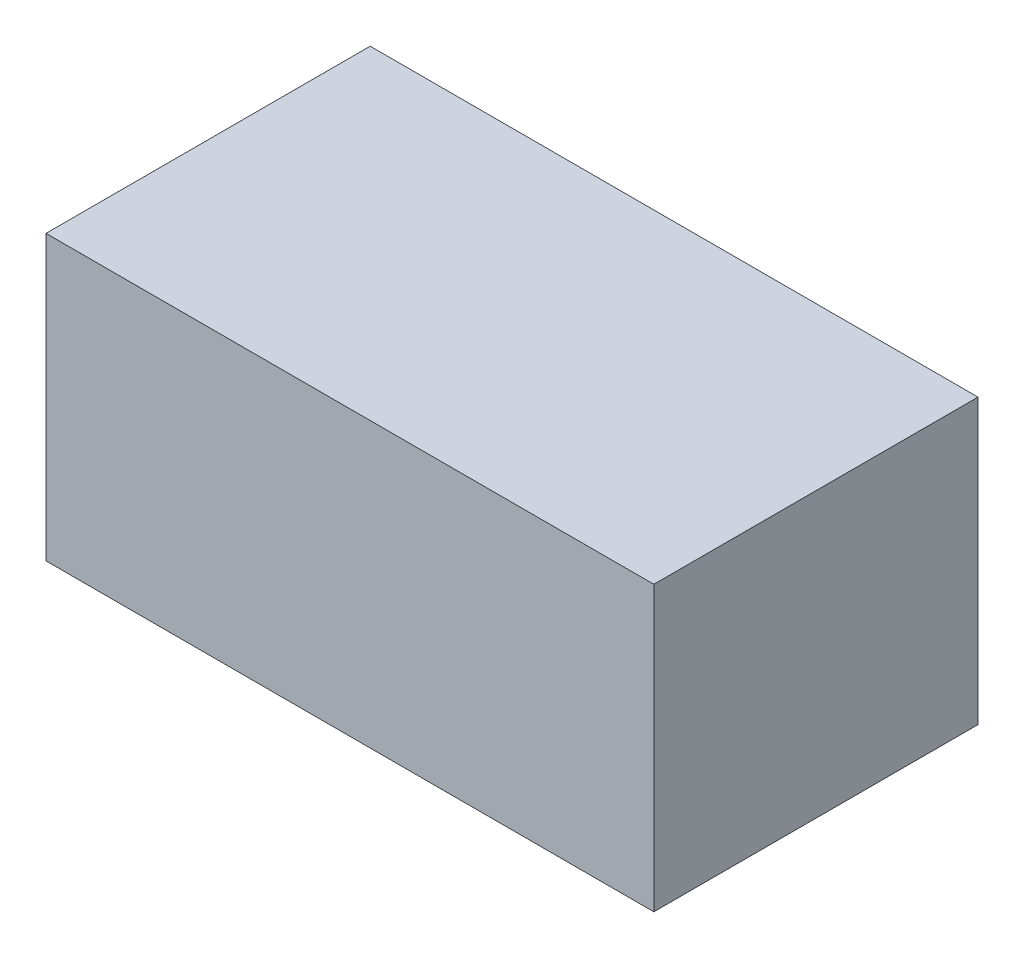
ISO-10303-21;
HEADER;
FILE_DESCRIPTION(('STEP AP214'),'2;1');
FILE_NAME('part.step','',(''),(''),'','','');
FILE_SCHEMA(('AUTOMOTIVE_DESIGN { 1 0 10303 214 1 1 1 1 }'));
ENDSEC;
DATA;
#1=APPLICATION_CONTEXT('core data for automotive mechanical design processes');
#2=APPLICATION_PROTOCOL_DEFINITION('international standard','automotive_design',2000,#1);
#3=PRODUCT_CONTEXT('',#1,'mechanical');
#4=PRODUCT('Part','Part','',(#3));
#5=PRODUCT_RELATED_PRODUCT_CATEGORY('part','',(#4));
#6=PRODUCT_DEFINITION_FORMATION('','',#4);
#7=PRODUCT_DEFINITION_CONTEXT('part definition',#1,'design');
#8=PRODUCT_DEFINITION('design','',#6,#7);
#9=PRODUCT_DEFINITION_SHAPE('','',#8);
#10=(LENGTH_UNIT() NAMED_UNIT(*) SI_UNIT(.MILLI.,.METRE.));
#11=(NAMED_UNIT(*) PLANE_ANGLE_UNIT() SI_UNIT($,.RADIAN.));
#12=(NAMED_UNIT(*) SI_UNIT($,.STERADIAN.) SOLID_ANGLE_UNIT());
#13=UNCERTAINTY_MEASURE_WITH_UNIT(LENGTH_MEASURE(1.E-05),#10,'distance_accuracy_value','');
#14=(GEOMETRIC_REPRESENTATION_CONTEXT(3) GLOBAL_UNCERTAINTY_ASSIGNED_CONTEXT((#13)) GLOBAL_UNIT_ASSIGNED_CONTEXT((#10,
#11,#12)) REPRESENTATION_CONTEXT('',''));
#15=CARTESIAN_POINT('',(0.,0.,0.));
#16=DIRECTION('',(0.,0.,1.));
#17=DIRECTION('',(1.,0.,0.));
#18=AXIS2_PLACEMENT_3D('',#15,#16,#17);
#19=CARTESIAN_POINT('',(-2065.03339191564,2133.6,-940.112478031635));
#20=DIRECTION('',(1.,0.,0.));
#21=DIRECTION('',(0.,0.,-1.));
#22=AXIS2_PLACEMENT_3D('',#19,#20,#21);
#23=PLANE('',#22);
#24=DIRECTION('',(0.,0.,1.));
#25=VECTOR('',#24,1.);
#26=CARTESIAN_POINT('',(-2065.03339191564,0.,-940.112478031635));
#27=LINE('',#26,#25);
#28=CARTESIAN_POINT('',(-2065.03339191564,0.,-940.112478031635));
#29=VERTEX_POINT('',#28);
#30=CARTESIAN_POINT('',(-2065.03339191564,0.,1498.28752196837));
#31=VERTEX_POINT('',#30);
#32=EDGE_CURVE('E102',#29,#31,#27,.T.);
#33=ORIENTED_EDGE('',*,*,#32,.T.);
#34=DIRECTION('',(0.,-1.,0.));
#35=VECTOR('',#34,1.);
#36=CARTESIAN_POINT('',(-2065.03339191564,2133.6,1498.28752196837));
#37=LINE('',#36,#35);
#38=CARTESIAN_POINT('',(-2065.03339191564,2133.6,1498.28752196837));
#39=VERTEX_POINT('',#38);
#40=EDGE_CURVE('E11',#39,#31,#37,.T.);
#41=ORIENTED_EDGE('',*,*,#40,.F.);
#42=DIRECTION('',(0.,0.,1.));
#43=VECTOR('',#42,1.);
#44=CARTESIAN_POINT('',(-2065.03339191564,2133.6,-940.112478031635));
#45=LINE('',#44,#43);
#46=CARTESIAN_POINT('',(-2065.03339191564,2133.6,-940.112478031635));
#47=VERTEX_POINT('',#46);
#48=EDGE_CURVE('E90',#47,#39,#45,.T.);
#49=ORIENTED_EDGE('',*,*,#48,.F.);
#50=DIRECTION('',(0.,-1.,0.));
#51=VECTOR('',#50,1.);
#52=CARTESIAN_POINT('',(-2065.03339191564,2133.6,-940.112478031635));
#53=LINE('',#52,#51);
#54=EDGE_CURVE('E98',#47,#29,#53,.T.);
#55=ORIENTED_EDGE('',*,*,#54,.T.);
#56=EDGE_LOOP('',(#33,#41,#49,#55));
#57=FACE_BOUND('',#56,.T.);
#58=ADVANCED_FACE('F39',(#57),#23,.F.);
#59=CARTESIAN_POINT('',(-2065.03339191564,2133.6,1498.28752196837));
#60=DIRECTION('',(0.,0.,-1.));
#61=DIRECTION('',(-1.,0.,0.));
#62=AXIS2_PLACEMENT_3D('',#59,#60,#61);
#63=PLANE('',#62);
#64=DIRECTION('',(1.,0.,0.));
#65=VECTOR('',#64,1.);
#66=CARTESIAN_POINT('',(-2065.03339191564,0.,1498.28752196837));
#67=LINE('',#66,#65);
#68=CARTESIAN_POINT('',(2506.96660808436,0.,1498.28752196837));
#69=VERTEX_POINT('',#68);
#70=EDGE_CURVE('E94',#31,#69,#67,.T.);
#71=ORIENTED_EDGE('',*,*,#70,.T.);
#72=DIRECTION('',(0.,-1.,0.));
#73=VECTOR('',#72,1.);
#74=CARTESIAN_POINT('',(2506.96660808436,2133.6,1498.28752196837));
#75=LINE('',#74,#73);
#76=CARTESIAN_POINT('',(2506.96660808436,2133.6,1498.28752196837));
#77=VERTEX_POINT('',#76);
#78=EDGE_CURVE('E47',#77,#69,#75,.T.);
#79=ORIENTED_EDGE('',*,*,#78,.F.);
#80=DIRECTION('',(1.,0.,0.));
#81=VECTOR('',#80,1.);
#82=CARTESIAN_POINT('',(-2065.03339191564,2133.6,1498.28752196837));
#83=LINE('',#82,#81);
#84=EDGE_CURVE('E85',#39,#77,#83,.T.);
#85=ORIENTED_EDGE('',*,*,#84,.F.);
#86=ORIENTED_EDGE('',*,*,#40,.T.);
#87=EDGE_LOOP('',(#71,#79,#85,#86));
#88=FACE_BOUND('',#87,.T.);
#89=ADVANCED_FACE('F93',(#88),#63,.F.);
#90=CARTESIAN_POINT('',(2506.96660808436,2133.6,-940.112478031635));
#91=DIRECTION('',(-1.,0.,0.));
#92=DIRECTION('',(0.,0.,1.));
#93=AXIS2_PLACEMENT_3D('',#90,#91,#92);
#94=PLANE('',#93);
#95=DIRECTION('',(0.,0.,-1.));
#96=VECTOR('',#95,1.);
#97=CARTESIAN_POINT('',(2506.96660808436,0.,-940.112478031635));
#98=LINE('',#97,#96);
#99=CARTESIAN_POINT('',(2506.96660808436,0.,-940.112478031635));
#100=VERTEX_POINT('',#99);
#101=EDGE_CURVE('E72',#69,#100,#98,.T.);
#102=ORIENTED_EDGE('',*,*,#101,.T.);
#103=DIRECTION('',(0.,-1.,0.));
#104=VECTOR('',#103,1.);
#105=CARTESIAN_POINT('',(2506.96660808436,2133.6,-940.112478031635));
#106=LINE('',#105,#104);
#107=CARTESIAN_POINT('',(2506.96660808436,2133.6,-940.112478031635));
#108=VERTEX_POINT('',#107);
#109=EDGE_CURVE('E95',#108,#100,#106,.T.);
#110=ORIENTED_EDGE('',*,*,#109,.F.);
#111=DIRECTION('',(0.,0.,-1.));
#112=VECTOR('',#111,1.);
#113=CARTESIAN_POINT('',(2506.96660808436,2133.6,-940.112478031635));
#114=LINE('',#113,#112);
#115=EDGE_CURVE('E88',#77,#108,#114,.T.);
#116=ORIENTED_EDGE('',*,*,#115,.F.);
#117=ORIENTED_EDGE('',*,*,#78,.T.);
#118=EDGE_LOOP('',(#102,#110,#116,#117));
#119=FACE_BOUND('',#118,.T.);
#120=ADVANCED_FACE('F96',(#119),#94,.F.);
#121=CARTESIAN_POINT('',(-2065.03339191564,2133.6,-940.112478031635));
#122=DIRECTION('',(0.,0.,1.));
#123=DIRECTION('',(1.,0.,0.));
#124=AXIS2_PLACEMENT_3D('',#121,#122,#123);
#125=PLANE('',#124);
#126=DIRECTION('',(-1.,0.,0.));
#127=VECTOR('',#126,1.);
#128=CARTESIAN_POINT('',(-2065.03339191564,0.,-940.112478031635));
#129=LINE('',#128,#127);
#130=EDGE_CURVE('E78',#100,#29,#129,.T.);
#131=ORIENTED_EDGE('',*,*,#130,.T.);
#132=ORIENTED_EDGE('',*,*,#54,.F.);
#133=DIRECTION('',(-1.,0.,0.));
#134=VECTOR('',#133,1.);
#135=CARTESIAN_POINT('',(-2065.03339191564,2133.6,-940.112478031635));
#136=LINE('',#135,#134);
#137=EDGE_CURVE('E55',#108,#47,#136,.T.);
#138=ORIENTED_EDGE('',*,*,#137,.F.);
#139=ORIENTED_EDGE('',*,*,#109,.T.);
#140=EDGE_LOOP('',(#131,#132,#138,#139));
#141=FACE_BOUND('',#140,.T.);
#142=ADVANCED_FACE('F109',(#141),#125,.F.);
#143=CARTESIAN_POINT('',(0.,2133.6,0.));
#144=DIRECTION('',(0.,1.,0.));
#145=DIRECTION('',(0.,0.,1.));
#146=AXIS2_PLACEMENT_3D('',#143,#144,#145);
#147=PLANE('',#146);
#148=ORIENTED_EDGE('',*,*,#48,.T.);
#149=ORIENTED_EDGE('',*,*,#84,.T.);
#150=ORIENTED_EDGE('',*,*,#115,.T.);
#151=ORIENTED_EDGE('',*,*,#137,.T.);
#152=EDGE_LOOP('',(#148,#149,#150,#151));
#153=FACE_BOUND('',#152,.T.);
#154=ADVANCED_FACE('F86',(#153),#147,.T.);
#155=CARTESIAN_POINT('',(0.,0.,0.));
#156=DIRECTION('',(0.,1.,0.));
#157=DIRECTION('',(0.,0.,1.));
#158=AXIS2_PLACEMENT_3D('',#155,#156,#157);
#159=PLANE('',#158);
#160=ORIENTED_EDGE('',*,*,#32,.F.);
#161=ORIENTED_EDGE('',*,*,#130,.F.);
#162=ORIENTED_EDGE('',*,*,#101,.F.);
#163=ORIENTED_EDGE('',*,*,#70,.F.);
#164=EDGE_LOOP('',(#160,#161,#162,#163));
#165=FACE_BOUND('',#164,.T.);
#166=ADVANCED_FACE('F112',(#165),#159,.F.);
#167=CLOSED_SHELL('',(#58,#89,#120,#142,#154,#166));
#168=MANIFOLD_SOLID_BREP('B2',#167);
#169=ADVANCED_BREP_SHAPE_REPRESENTATION('',(#18,#168),#14);
#170=SHAPE_DEFINITION_REPRESENTATION(#9,#169);
ENDSEC;
END-ISO-10303-21;
